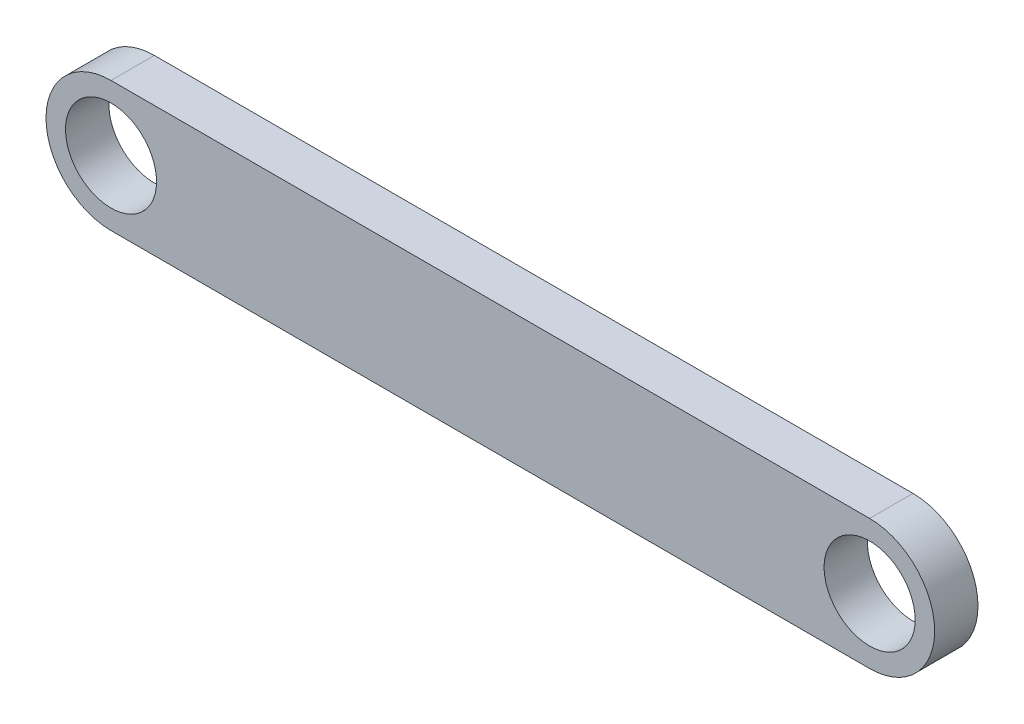
ISO-10303-21;
HEADER;
FILE_DESCRIPTION(('STEP AP214'),'2;1');
FILE_NAME('part.step','',(''),(''),'','','');
FILE_SCHEMA(('AUTOMOTIVE_DESIGN { 1 0 10303 214 1 1 1 1 }'));
ENDSEC;
DATA;
#1=APPLICATION_CONTEXT('core data for automotive mechanical design processes');
#2=APPLICATION_PROTOCOL_DEFINITION('international standard','automotive_design',2000,#1);
#3=PRODUCT_CONTEXT('',#1,'mechanical');
#4=PRODUCT('Part','Part','',(#3));
#5=PRODUCT_RELATED_PRODUCT_CATEGORY('part','',(#4));
#6=PRODUCT_DEFINITION_FORMATION('','',#4);
#7=PRODUCT_DEFINITION_CONTEXT('part definition',#1,'design');
#8=PRODUCT_DEFINITION('design','',#6,#7);
#9=PRODUCT_DEFINITION_SHAPE('','',#8);
#10=(LENGTH_UNIT() NAMED_UNIT(*) SI_UNIT(.MILLI.,.METRE.));
#11=(NAMED_UNIT(*) PLANE_ANGLE_UNIT() SI_UNIT($,.RADIAN.));
#12=(NAMED_UNIT(*) SI_UNIT($,.STERADIAN.) SOLID_ANGLE_UNIT());
#13=UNCERTAINTY_MEASURE_WITH_UNIT(LENGTH_MEASURE(1.E-05),#10,'distance_accuracy_value','');
#14=(GEOMETRIC_REPRESENTATION_CONTEXT(3) GLOBAL_UNCERTAINTY_ASSIGNED_CONTEXT((#13)) GLOBAL_UNIT_ASSIGNED_CONTEXT((#10,
#11,#12)) REPRESENTATION_CONTEXT('',''));
#15=CARTESIAN_POINT('',(0.,0.,0.));
#16=DIRECTION('',(0.,0.,1.));
#17=DIRECTION('',(1.,0.,0.));
#18=AXIS2_PLACEMENT_3D('',#15,#16,#17);
#19=CARTESIAN_POINT('',(-20.,0.,4.));
#20=DIRECTION('',(0.,0.,-1.));
#21=DIRECTION('',(-1.,0.,0.));
#22=AXIS2_PLACEMENT_3D('',#19,#20,#21);
#23=CYLINDRICAL_SURFACE('',#22,6.);
#24=CARTESIAN_POINT('',(-20.,0.,0.));
#25=DIRECTION('',(0.,0.,-1.));
#26=DIRECTION('',(-1.,0.,0.));
#27=AXIS2_PLACEMENT_3D('',#24,#25,#26);
#28=CIRCLE('',#27,6.);
#29=CARTESIAN_POINT('',(-20.,-6.,0.));
#30=VERTEX_POINT('',#29);
#31=CARTESIAN_POINT('',(-20.,6.00000000000001,0.));
#32=VERTEX_POINT('',#31);
#33=EDGE_CURVE('E100',#30,#32,#28,.T.);
#34=ORIENTED_EDGE('',*,*,#33,.F.);
#35=DIRECTION('',(0.,0.,-1.));
#36=VECTOR('',#35,1.);
#37=CARTESIAN_POINT('',(-20.,-6.,4.));
#38=LINE('',#37,#36);
#39=CARTESIAN_POINT('',(-20.,-6.,4.));
#40=VERTEX_POINT('',#39);
#41=EDGE_CURVE('E11',#40,#30,#38,.T.);
#42=ORIENTED_EDGE('',*,*,#41,.F.);
#43=CARTESIAN_POINT('',(-20.,0.,4.));
#44=DIRECTION('',(0.,0.,-1.));
#45=DIRECTION('',(-1.,0.,0.));
#46=AXIS2_PLACEMENT_3D('',#43,#44,#45);
#47=CIRCLE('',#46,6.);
#48=CARTESIAN_POINT('',(-20.,6.00000000000001,4.));
#49=VERTEX_POINT('',#48);
#50=EDGE_CURVE('E93',#40,#49,#47,.T.);
#51=ORIENTED_EDGE('',*,*,#50,.T.);
#52=DIRECTION('',(0.,0.,-1.));
#53=VECTOR('',#52,1.);
#54=CARTESIAN_POINT('',(-20.,6.00000000000001,4.));
#55=LINE('',#54,#53);
#56=EDGE_CURVE('E38',#49,#32,#55,.T.);
#57=ORIENTED_EDGE('',*,*,#56,.T.);
#58=EDGE_LOOP('',(#34,#42,#51,#57));
#59=FACE_BOUND('',#58,.T.);
#60=ADVANCED_FACE('F35',(#59),#23,.T.);
#61=CARTESIAN_POINT('',(50.,-6.,4.));
#62=DIRECTION('',(0.,-1.,0.));
#63=DIRECTION('',(0.,0.,-1.));
#64=AXIS2_PLACEMENT_3D('',#61,#62,#63);
#65=PLANE('',#64);
#66=DIRECTION('',(-1.,0.,0.));
#67=VECTOR('',#66,1.);
#68=CARTESIAN_POINT('',(50.,-6.,0.));
#69=LINE('',#68,#67);
#70=CARTESIAN_POINT('',(50.,-6.,0.));
#71=VERTEX_POINT('',#70);
#72=EDGE_CURVE('E95',#71,#30,#69,.T.);
#73=ORIENTED_EDGE('',*,*,#72,.F.);
#74=DIRECTION('',(0.,0.,-1.));
#75=VECTOR('',#74,1.);
#76=CARTESIAN_POINT('',(50.,-6.,4.));
#77=LINE('',#76,#75);
#78=CARTESIAN_POINT('',(50.,-6.,4.));
#79=VERTEX_POINT('',#78);
#80=EDGE_CURVE('E44',#79,#71,#77,.T.);
#81=ORIENTED_EDGE('',*,*,#80,.F.);
#82=DIRECTION('',(-1.,0.,0.));
#83=VECTOR('',#82,1.);
#84=CARTESIAN_POINT('',(50.,-6.,4.));
#85=LINE('',#84,#83);
#86=EDGE_CURVE('E90',#79,#40,#85,.T.);
#87=ORIENTED_EDGE('',*,*,#86,.T.);
#88=ORIENTED_EDGE('',*,*,#41,.T.);
#89=EDGE_LOOP('',(#73,#81,#87,#88));
#90=FACE_BOUND('',#89,.T.);
#91=ADVANCED_FACE('F111',(#90),#65,.T.);
#92=CARTESIAN_POINT('',(50.,0.,4.));
#93=DIRECTION('',(0.,0.,-1.));
#94=DIRECTION('',(-1.,0.,0.));
#95=AXIS2_PLACEMENT_3D('',#92,#93,#94);
#96=CYLINDRICAL_SURFACE('',#95,6.);
#97=CARTESIAN_POINT('',(50.,0.,0.));
#98=DIRECTION('',(0.,0.,-1.));
#99=DIRECTION('',(-1.,0.,0.));
#100=AXIS2_PLACEMENT_3D('',#97,#98,#99);
#101=CIRCLE('',#100,6.);
#102=CARTESIAN_POINT('',(50.,6.,0.));
#103=VERTEX_POINT('',#102);
#104=EDGE_CURVE('E85',#103,#71,#101,.T.);
#105=ORIENTED_EDGE('',*,*,#104,.F.);
#106=DIRECTION('',(0.,0.,-1.));
#107=VECTOR('',#106,1.);
#108=CARTESIAN_POINT('',(50.,6.,4.));
#109=LINE('',#108,#107);
#110=CARTESIAN_POINT('',(50.,6.,4.));
#111=VERTEX_POINT('',#110);
#112=EDGE_CURVE('E80',#111,#103,#109,.T.);
#113=ORIENTED_EDGE('',*,*,#112,.F.);
#114=CARTESIAN_POINT('',(50.,0.,4.));
#115=DIRECTION('',(0.,0.,-1.));
#116=DIRECTION('',(-1.,0.,0.));
#117=AXIS2_PLACEMENT_3D('',#114,#115,#116);
#118=CIRCLE('',#117,6.);
#119=EDGE_CURVE('E83',#111,#79,#118,.T.);
#120=ORIENTED_EDGE('',*,*,#119,.T.);
#121=ORIENTED_EDGE('',*,*,#80,.T.);
#122=EDGE_LOOP('',(#105,#113,#120,#121));
#123=FACE_BOUND('',#122,.T.);
#124=ADVANCED_FACE('F82',(#123),#96,.T.);
#125=CARTESIAN_POINT('',(-20.,6.00000000000001,4.));
#126=DIRECTION('',(0.,1.,0.));
#127=DIRECTION('',(-1.,0.,0.));
#128=AXIS2_PLACEMENT_3D('',#125,#126,#127);
#129=PLANE('',#128);
#130=DIRECTION('',(1.,0.,0.));
#131=VECTOR('',#130,1.);
#132=CARTESIAN_POINT('',(-20.,6.00000000000001,0.));
#133=LINE('',#132,#131);
#134=EDGE_CURVE('E103',#32,#103,#133,.T.);
#135=ORIENTED_EDGE('',*,*,#134,.F.);
#136=ORIENTED_EDGE('',*,*,#56,.F.);
#137=DIRECTION('',(1.,0.,0.));
#138=VECTOR('',#137,1.);
#139=CARTESIAN_POINT('',(-20.,6.00000000000001,4.));
#140=LINE('',#139,#138);
#141=EDGE_CURVE('E89',#49,#111,#140,.T.);
#142=ORIENTED_EDGE('',*,*,#141,.T.);
#143=ORIENTED_EDGE('',*,*,#112,.T.);
#144=EDGE_LOOP('',(#135,#136,#142,#143));
#145=FACE_BOUND('',#144,.T.);
#146=ADVANCED_FACE('F92',(#145),#129,.T.);
#147=CARTESIAN_POINT('',(-20.,0.,4.));
#148=DIRECTION('',(0.,0.,-1.));
#149=DIRECTION('',(-1.,0.,0.));
#150=AXIS2_PLACEMENT_3D('',#147,#148,#149);
#151=PLANE('',#150);
#152=CARTESIAN_POINT('',(50.,0.,4.));
#153=DIRECTION('',(0.,0.,-1.));
#154=DIRECTION('',(1.,0.,0.));
#155=AXIS2_PLACEMENT_3D('',#152,#153,#154);
#156=CIRCLE('',#155,4.2);
#157=CARTESIAN_POINT('',(54.2,0.,4.));
#158=VERTEX_POINT('',#157);
#159=EDGE_CURVE('E144',#158,#158,#156,.T.);
#160=ORIENTED_EDGE('',*,*,#159,.T.);
#161=EDGE_LOOP('',(#160));
#162=FACE_BOUND('',#161,.T.);
#163=CARTESIAN_POINT('',(-20.,0.,4.));
#164=DIRECTION('',(0.,0.,-1.));
#165=DIRECTION('',(1.,0.,0.));
#166=AXIS2_PLACEMENT_3D('',#163,#164,#165);
#167=CIRCLE('',#166,4.2);
#168=CARTESIAN_POINT('',(-15.8,0.,4.));
#169=VERTEX_POINT('',#168);
#170=EDGE_CURVE('E104',#169,#169,#167,.T.);
#171=ORIENTED_EDGE('',*,*,#170,.T.);
#172=EDGE_LOOP('',(#171));
#173=FACE_BOUND('',#172,.T.);
#174=ORIENTED_EDGE('',*,*,#50,.F.);
#175=ORIENTED_EDGE('',*,*,#86,.F.);
#176=ORIENTED_EDGE('',*,*,#119,.F.);
#177=ORIENTED_EDGE('',*,*,#141,.F.);
#178=EDGE_LOOP('',(#174,#175,#176,#177));
#179=FACE_BOUND('',#178,.T.);
#180=ADVANCED_FACE('F88',(#162,#173,#179),#151,.F.);
#181=CARTESIAN_POINT('',(-20.,0.,0.));
#182=DIRECTION('',(0.,0.,-1.));
#183=DIRECTION('',(-1.,0.,0.));
#184=AXIS2_PLACEMENT_3D('',#181,#182,#183);
#185=PLANE('',#184);
#186=CARTESIAN_POINT('',(50.,0.,0.));
#187=DIRECTION('',(0.,0.,-1.));
#188=DIRECTION('',(1.,0.,0.));
#189=AXIS2_PLACEMENT_3D('',#186,#187,#188);
#190=CIRCLE('',#189,4.2);
#191=CARTESIAN_POINT('',(54.2,0.,0.));
#192=VERTEX_POINT('',#191);
#193=EDGE_CURVE('E147',#192,#192,#190,.T.);
#194=ORIENTED_EDGE('',*,*,#193,.F.);
#195=EDGE_LOOP('',(#194));
#196=FACE_BOUND('',#195,.T.);
#197=CARTESIAN_POINT('',(-20.,0.,0.));
#198=DIRECTION('',(0.,0.,-1.));
#199=DIRECTION('',(1.,0.,0.));
#200=AXIS2_PLACEMENT_3D('',#197,#198,#199);
#201=CIRCLE('',#200,4.2);
#202=CARTESIAN_POINT('',(-15.8,0.,0.));
#203=VERTEX_POINT('',#202);
#204=EDGE_CURVE('E149',#203,#203,#201,.T.);
#205=ORIENTED_EDGE('',*,*,#204,.F.);
#206=EDGE_LOOP('',(#205));
#207=FACE_BOUND('',#206,.T.);
#208=ORIENTED_EDGE('',*,*,#33,.T.);
#209=ORIENTED_EDGE('',*,*,#134,.T.);
#210=ORIENTED_EDGE('',*,*,#104,.T.);
#211=ORIENTED_EDGE('',*,*,#72,.T.);
#212=EDGE_LOOP('',(#208,#209,#210,#211));
#213=FACE_BOUND('',#212,.T.);
#214=ADVANCED_FACE('F110',(#196,#207,#213),#185,.T.);
#215=CARTESIAN_POINT('',(-20.,0.,4.));
#216=DIRECTION('',(0.,0.,-1.));
#217=DIRECTION('',(-1.,0.,0.));
#218=AXIS2_PLACEMENT_3D('',#215,#216,#217);
#219=CYLINDRICAL_SURFACE('',#218,4.2);
#220=ORIENTED_EDGE('',*,*,#170,.F.);
#221=EDGE_LOOP('',(#220));
#222=FACE_BOUND('',#221,.T.);
#223=ORIENTED_EDGE('',*,*,#204,.T.);
#224=EDGE_LOOP('',(#223));
#225=FACE_BOUND('',#224,.T.);
#226=ADVANCED_FACE('F129',(#222,#225),#219,.F.);
#227=CARTESIAN_POINT('',(50.,0.,4.));
#228=DIRECTION('',(0.,0.,-1.));
#229=DIRECTION('',(-1.,0.,0.));
#230=AXIS2_PLACEMENT_3D('',#227,#228,#229);
#231=CYLINDRICAL_SURFACE('',#230,4.2);
#232=ORIENTED_EDGE('',*,*,#159,.F.);
#233=EDGE_LOOP('',(#232));
#234=FACE_BOUND('',#233,.T.);
#235=ORIENTED_EDGE('',*,*,#193,.T.);
#236=EDGE_LOOP('',(#235));
#237=FACE_BOUND('',#236,.T.);
#238=ADVANCED_FACE('F136',(#234,#237),#231,.F.);
#239=CLOSED_SHELL('',(#60,#91,#124,#146,#180,#214,#226,#238));
#240=MANIFOLD_SOLID_BREP('B2',#239);
#241=ADVANCED_BREP_SHAPE_REPRESENTATION('',(#18,#240),#14);
#242=SHAPE_DEFINITION_REPRESENTATION(#9,#241);
ENDSEC;
END-ISO-10303-21;
